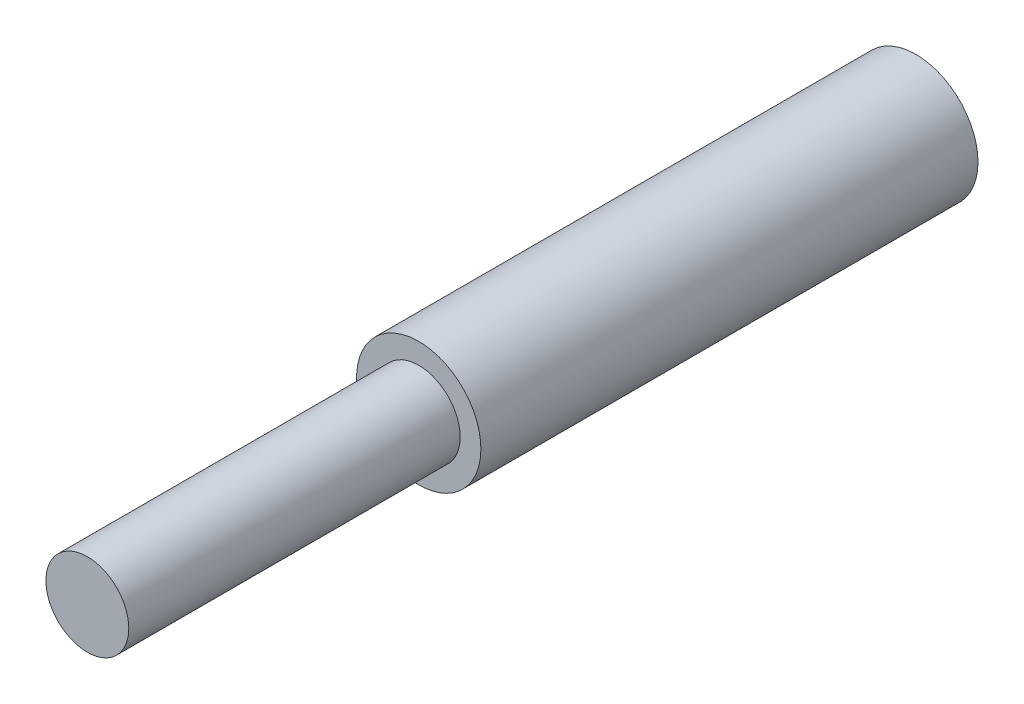
ISO-10303-21;
HEADER;
FILE_DESCRIPTION(('STEP AP214'),'2;1');
FILE_NAME('part.step','',(''),(''),'','','');
FILE_SCHEMA(('AUTOMOTIVE_DESIGN { 1 0 10303 214 1 1 1 1 }'));
ENDSEC;
DATA;
#1=APPLICATION_CONTEXT('core data for automotive mechanical design processes');
#2=APPLICATION_PROTOCOL_DEFINITION('international standard','automotive_design',2000,#1);
#3=PRODUCT_CONTEXT('',#1,'mechanical');
#4=PRODUCT('Part','Part','',(#3));
#5=PRODUCT_RELATED_PRODUCT_CATEGORY('part','',(#4));
#6=PRODUCT_DEFINITION_FORMATION('','',#4);
#7=PRODUCT_DEFINITION_CONTEXT('part definition',#1,'design');
#8=PRODUCT_DEFINITION('design','',#6,#7);
#9=PRODUCT_DEFINITION_SHAPE('','',#8);
#10=(LENGTH_UNIT() NAMED_UNIT(*) SI_UNIT(.MILLI.,.METRE.));
#11=(NAMED_UNIT(*) PLANE_ANGLE_UNIT() SI_UNIT($,.RADIAN.));
#12=(NAMED_UNIT(*) SI_UNIT($,.STERADIAN.) SOLID_ANGLE_UNIT());
#13=UNCERTAINTY_MEASURE_WITH_UNIT(LENGTH_MEASURE(1.E-05),#10,'distance_accuracy_value','');
#14=(GEOMETRIC_REPRESENTATION_CONTEXT(3) GLOBAL_UNCERTAINTY_ASSIGNED_CONTEXT((#13)) GLOBAL_UNIT_ASSIGNED_CONTEXT((#10,
#11,#12)) REPRESENTATION_CONTEXT('',''));
#15=CARTESIAN_POINT('',(0.,0.,0.));
#16=DIRECTION('',(0.,0.,1.));
#17=DIRECTION('',(1.,0.,0.));
#18=AXIS2_PLACEMENT_3D('',#15,#16,#17);
#19=CARTESIAN_POINT('',(0.,0.,100.));
#20=DIRECTION('',(0.,0.,-1.));
#21=DIRECTION('',(-1.,0.,0.));
#22=AXIS2_PLACEMENT_3D('',#19,#20,#21);
#23=CYLINDRICAL_SURFACE('',#22,7.5);
#24=CARTESIAN_POINT('',(0.,0.,0.));
#25=DIRECTION('',(0.,0.,1.));
#26=DIRECTION('',(1.,0.,0.));
#27=AXIS2_PLACEMENT_3D('',#24,#25,#26);
#28=CIRCLE('',#27,7.5);
#29=CARTESIAN_POINT('',(7.5,0.,0.));
#30=VERTEX_POINT('',#29);
#31=EDGE_CURVE('E139',#30,#30,#28,.T.);
#32=ORIENTED_EDGE('',*,*,#31,.T.);
#33=EDGE_LOOP('',(#32));
#34=FACE_BOUND('',#33,.T.);
#35=CARTESIAN_POINT('',(0.,0.,60.));
#36=DIRECTION('',(0.,0.,1.));
#37=DIRECTION('',(1.,0.,0.));
#38=AXIS2_PLACEMENT_3D('',#35,#36,#37);
#39=CIRCLE('',#38,7.5);
#40=CARTESIAN_POINT('',(7.5,0.,60.));
#41=VERTEX_POINT('',#40);
#42=EDGE_CURVE('E135',#41,#41,#39,.T.);
#43=ORIENTED_EDGE('',*,*,#42,.F.);
#44=EDGE_LOOP('',(#43));
#45=FACE_BOUND('',#44,.T.);
#46=ADVANCED_FACE('F48',(#34,#45),#23,.T.);
#47=CARTESIAN_POINT('',(0.,0.,0.));
#48=DIRECTION('',(0.,0.,1.));
#49=DIRECTION('',(1.,0.,0.));
#50=AXIS2_PLACEMENT_3D('',#47,#48,#49);
#51=PLANE('',#50);
#52=ORIENTED_EDGE('',*,*,#31,.F.);
#53=EDGE_LOOP('',(#52));
#54=FACE_BOUND('',#53,.T.);
#55=ADVANCED_FACE('F186',(#54),#51,.F.);
#56=CARTESIAN_POINT('',(0.,0.,60.));
#57=DIRECTION('',(0.,0.,1.));
#58=DIRECTION('',(1.,0.,0.));
#59=AXIS2_PLACEMENT_3D('',#56,#57,#58);
#60=PLANE('',#59);
#61=CARTESIAN_POINT('',(0.,0.,60.));
#62=DIRECTION('',(0.,0.,1.));
#63=DIRECTION('',(1.,0.,0.));
#64=AXIS2_PLACEMENT_3D('',#61,#62,#63);
#65=CIRCLE('',#64,5.);
#66=CARTESIAN_POINT('',(5.10341196725696E-11,-5.,60.));
#67=VERTEX_POINT('',#66);
#68=EDGE_CURVE('E131',#67,#67,#65,.T.);
#69=ORIENTED_EDGE('',*,*,#68,.F.);
#70=EDGE_LOOP('',(#69));
#71=FACE_BOUND('',#70,.T.);
#72=ORIENTED_EDGE('',*,*,#42,.T.);
#73=EDGE_LOOP('',(#72));
#74=FACE_BOUND('',#73,.T.);
#75=ADVANCED_FACE('F192',(#71,#74),#60,.T.);
#76=CARTESIAN_POINT('',(0.,0.,60.));
#77=DIRECTION('',(0.,0.,1.));
#78=DIRECTION('',(1.,0.,0.));
#79=AXIS2_PLACEMENT_3D('',#76,#77,#78);
#80=CYLINDRICAL_SURFACE('',#79,5.);
#81=CARTESIAN_POINT('',(1.50000000004889,-4.76969600706936,73.5));
#82=CARTESIAN_POINT('',(1.50000085361959,-4.76969249083397,73.541179392908));
#83=CARTESIAN_POINT('',(1.49830317088317,-4.77022996998593,73.5823380431261));
#84=CARTESIAN_POINT('',(1.49153785665208,-4.7723509510847,73.6643411620955));
#85=CARTESIAN_POINT('',(1.48647098280734,-4.77393421785852,73.7051856993949));
#86=CARTESIAN_POINT('',(1.4663020369421,-4.7801849061737,73.8265905409546));
#87=CARTESIAN_POINT('',(1.44623120418568,-4.78635370382792,73.9063063904163));
#88=CARTESIAN_POINT('',(1.39353102320548,-4.8019595211178,74.0610355783859));
#89=CARTESIAN_POINT('',(1.36090607073134,-4.81139539668998,74.1360505521981));
#90=CARTESIAN_POINT('',(1.28407841122608,-4.83246571210736,74.2795966815976));
#91=CARTESIAN_POINT('',(1.23987031656191,-4.84410117433662,74.3481247997284));
#92=CARTESIAN_POINT('',(1.13964850663316,-4.86866835243553,74.478866055997));
#93=CARTESIAN_POINT('',(1.08333433470212,-4.88162755411864,74.5408436603434));
#94=CARTESIAN_POINT('',(0.961138919923655,-4.90714811558064,74.6546355838999));
#95=CARTESIAN_POINT('',(0.89525606396678,-4.91970940784331,74.706448186003));
#96=CARTESIAN_POINT('',(0.754109921366105,-4.94333239726932,74.7994637703185));
#97=CARTESIAN_POINT('',(0.678680819387046,-4.95435770970658,74.8404251802979));
#98=CARTESIAN_POINT('',(0.521621185556751,-4.97334469845673,74.9089884116181));
#99=CARTESIAN_POINT('',(0.439992259063983,-4.98130716463452,74.9365936777943));
#100=CARTESIAN_POINT('',(0.275324697926051,-4.9930763993472,74.976879799102));
#101=CARTESIAN_POINT('',(0.192393125345466,-4.99699549276796,74.9899648579697));
#102=CARTESIAN_POINT('',(0.025423572049331,-5.000632020224,75.0021173413632));
#103=CARTESIAN_POINT('',(-0.058614196191116,-5.00035024971531,75.0011874197001));
#104=CARTESIAN_POINT('',(-0.22257159989482,-4.99569602566495,74.985607091241));
#105=CARTESIAN_POINT('',(-0.302537145413489,-4.99145415509497,74.9713946550213));
#106=CARTESIAN_POINT('',(-0.458890052050997,-4.9795151370045,74.9303683647619));
#107=CARTESIAN_POINT('',(-0.535277225481048,-4.97181780846577,74.903553850544));
#108=CARTESIAN_POINT('',(-0.683347815841449,-4.95365214926845,74.8377877783536));
#109=CARTESIAN_POINT('',(-0.754966005993479,-4.94315255693299,74.7986983556431));
#110=CARTESIAN_POINT('',(-0.890765529523988,-4.92049624652668,74.7096014099517));
#111=CARTESIAN_POINT('',(-0.954945191564289,-4.90833915736863,74.6595914405212));
#112=CARTESIAN_POINT('',(-1.0766545053627,-4.88311673572513,74.5478080119165));
#113=CARTESIAN_POINT('',(-1.13383351473042,-4.87003445450716,74.4856561362393));
#114=CARTESIAN_POINT('',(-1.23706769487521,-4.84484215115926,74.3525025765721));
#115=CARTESIAN_POINT('',(-1.28311962008124,-4.83273241338881,74.2814983196345));
#116=CARTESIAN_POINT('',(-1.36316407235932,-4.8107722879705,74.1317190715507));
#117=CARTESIAN_POINT('',(-1.39703006336214,-4.8009459624738,74.0528728204066));
#118=CARTESIAN_POINT('',(-1.45085885999795,-4.78495663654688,73.8902754960183));
#119=CARTESIAN_POINT('',(-1.47084293213138,-4.77878803477382,73.8065321392856));
#120=CARTESIAN_POINT('',(-1.48901203585188,-4.77314032326532,73.6850051109298));
#121=CARTESIAN_POINT('',(-1.49313202984118,-4.77185156276797,73.6481092658204));
#122=CARTESIAN_POINT('',(-1.49862355609965,-4.77012928613318,73.5741485209004));
#123=CARTESIAN_POINT('',(-1.4999991296338,-4.76969451248181,73.5370839503361));
#124=CARTESIAN_POINT('',(-1.49999999995112,-4.7696960071001,73.5));
#125=B_SPLINE_CURVE_WITH_KNOTS('',3,(#81,#82,#83,#84,#85,#86,#87,#88,#89,#90,#91,#92,#93,#94,
#95,#96,#97,#98,#99,#100,#101,#102,#103,#104,#105,#106,#107,#108,#109,#110,#111,#112,#113,#114,
#115,#116,#117,#118,#119,#120,#121,#122,#123,#124),.UNSPECIFIED.,.F.,.F.,(4,2,2,2,2,2,2,2,2,2,2,
2,2,2,2,2,2,2,2,2,2,4),(0.,0.123459071219737,0.246890388853026,0.492911349615204,
0.738846245884331,0.98489573682809,1.23795510798802,1.49105719006934,1.74939356197454,
2.00766326783256,2.25854751319802,2.5093842528947,2.75223130012966,2.99509107067836,
3.2407824256273,3.48652887757004,3.7417256831098,3.99699683536776,4.25484698071525,
4.51230123440206,4.62365084745809,4.73483637253619),.UNSPECIFIED.);
#126=CARTESIAN_POINT('',(1.50000000004889,-4.76969600706932,73.5));
#127=VERTEX_POINT('',#126);
#128=CARTESIAN_POINT('',(-1.49999999995112,-4.7696960071001,73.5));
#129=VERTEX_POINT('',#128);
#130=EDGE_CURVE('E143',#127,#129,#125,.T.);
#131=ORIENTED_EDGE('',*,*,#130,.F.);
#132=DIRECTION('',(0.,0.,1.));
#133=VECTOR('',#132,1.);
#134=CARTESIAN_POINT('',(1.50000000004899,-4.76969600706932,60.));
#135=LINE('',#134,#133);
#136=CARTESIAN_POINT('',(1.50000000004897,-4.76969600706933,61.5));
#137=VERTEX_POINT('',#136);
#138=EDGE_CURVE('E12',#137,#127,#135,.T.);
#139=ORIENTED_EDGE('',*,*,#138,.F.);
#140=CARTESIAN_POINT('',(-1.49999999995103,-4.76969600710013,61.5));
#141=CARTESIAN_POINT('',(-1.50000085352174,-4.76969249086474,61.4588206070919));
#142=CARTESIAN_POINT('',(-1.4983031707853,-4.77022997001667,61.4176619568738));
#143=CARTESIAN_POINT('',(-1.49153785655417,-4.7723509511153,61.3356588379044));
#144=CARTESIAN_POINT('',(-1.48647098270939,-4.77393421788902,61.2948143006051));
#145=CARTESIAN_POINT('',(-1.46630203684403,-4.78018490620379,61.1734094590453));
#146=CARTESIAN_POINT('',(-1.44623120408748,-4.7863537038576,61.0936936095836));
#147=CARTESIAN_POINT('',(-1.39353102310695,-4.80195952114639,60.9389644216141));
#148=CARTESIAN_POINT('',(-1.36090607063263,-4.8113953967179,60.8639494478019));
#149=CARTESIAN_POINT('',(-1.28407841112693,-4.8324657121337,60.7204033184024));
#150=CARTESIAN_POINT('',(-1.23987031646252,-4.84410117436206,60.6518752002715));
#151=CARTESIAN_POINT('',(-1.13964850653326,-4.86866835245891,60.5211339440029));
#152=CARTESIAN_POINT('',(-1.08333433460195,-4.88162755414087,60.4591563396565));
#153=CARTESIAN_POINT('',(-0.961138919822953,-4.90714811560037,60.3453644161));
#154=CARTESIAN_POINT('',(-0.895256063865817,-4.91970940786169,60.2935518139969));
#155=CARTESIAN_POINT('',(-0.754109921264656,-4.9433323972848,60.2005362296815));
#156=CARTESIAN_POINT('',(-0.678680819285372,-4.95435770972051,60.159574819702));
#157=CARTESIAN_POINT('',(-0.521621185454693,-4.97334469846744,60.0910115883818));
#158=CARTESIAN_POINT('',(-0.439992258961766,-4.98130716464355,60.0634063222057));
#159=CARTESIAN_POINT('',(-0.275324697823598,-4.99307639935285,60.0231202008979));
#160=CARTESIAN_POINT('',(-0.192393125242934,-4.9969954927719,60.0100351420302));
#161=CARTESIAN_POINT('',(-0.0254235719467276,-5.00063202022452,59.9978826586367));
#162=CARTESIAN_POINT('',(0.0586141962937121,-5.00035024971411,59.9988125802998));
#163=CARTESIAN_POINT('',(0.222571599997317,-4.99569602566038,60.014392908759));
#164=CARTESIAN_POINT('',(0.302537145515897,-4.99145415508877,60.0286053449787));
#165=CARTESIAN_POINT('',(0.458890052153158,-4.97951513699509,60.0696316352381));
#166=CARTESIAN_POINT('',(0.53527722558305,-4.97181780845479,60.0964461494559));
#167=CARTESIAN_POINT('',(0.683347815943082,-4.95365214925443,60.1622122216464));
#168=CARTESIAN_POINT('',(0.754966006094901,-4.9431525569175,60.2013016443569));
#169=CARTESIAN_POINT('',(0.890765529624948,-4.92049624650841,60.2903985900483));
#170=CARTESIAN_POINT('',(0.954945191664998,-4.90833915734904,60.3404085594788));
#171=CARTESIAN_POINT('',(1.07665450546289,-4.88311673570304,60.4521919880835));
#172=CARTESIAN_POINT('',(1.13383351483035,-4.87003445448389,60.5143438637607));
#173=CARTESIAN_POINT('',(1.23706769497462,-4.84484215113388,60.6474974234279));
#174=CARTESIAN_POINT('',(1.28311962018041,-4.83273241336248,60.7185016803655));
#175=CARTESIAN_POINT('',(1.36316407245804,-4.81077228794253,60.8682809284493));
#176=CARTESIAN_POINT('',(1.39703006346065,-4.80094596244513,60.9471271795934));
#177=CARTESIAN_POINT('',(1.45085886009613,-4.78495663651711,61.1097245039817));
#178=CARTESIAN_POINT('',(1.47084293222943,-4.77878803474364,61.1934678607144));
#179=CARTESIAN_POINT('',(1.48901203594981,-4.77314032323477,61.3149948890702));
#180=CARTESIAN_POINT('',(1.49313202993908,-4.77185156273734,61.3518907341796));
#181=CARTESIAN_POINT('',(1.49862355619752,-4.77012928610243,61.4258514790995));
#182=CARTESIAN_POINT('',(1.49999912973166,-4.76969451245104,61.4629160496638));
#183=CARTESIAN_POINT('',(1.50000000004897,-4.76969600706933,61.5));
#184=B_SPLINE_CURVE_WITH_KNOTS('',3,(#140,#141,#142,#143,#144,#145,#146,#147,#148,#149,#150,
#151,#152,#153,#154,#155,#156,#157,#158,#159,#160,#161,#162,#163,#164,#165,#166,#167,#168,#169,
#170,#171,#172,#173,#174,#175,#176,#177,#178,#179,#180,#181,#182,#183),.UNSPECIFIED.,.F.,.F.,(4,
2,2,2,2,2,2,2,2,2,2,2,2,2,2,2,2,2,2,2,2,4),(0.,0.123459071219744,0.246890388853047,
0.492911349615219,0.738846245884331,0.984895736828099,1.23795510798805,1.49105719006938,
1.74939356197457,2.00766326783257,2.25854751319802,2.5093842528947,2.75223130012966,
2.99509107067836,3.24078242562731,3.48652887757005,3.74172568310982,3.99699683536779,
4.25484698071529,4.51230123440208,4.62365084745809,4.73483637253615),.UNSPECIFIED.);
#185=EDGE_CURVE('E97',#67,#137,#184,.T.);
#186=ORIENTED_EDGE('',*,*,#185,.F.);
#187=ORIENTED_EDGE('',*,*,#68,.T.);
#188=CARTESIAN_POINT('',(-1.49999999995103,-4.76969600710014,61.5));
#189=VERTEX_POINT('',#188);
#190=EDGE_CURVE('E56',#189,#67,#184,.T.);
#191=ORIENTED_EDGE('',*,*,#190,.F.);
#192=DIRECTION('',(0.,0.,1.));
#193=VECTOR('',#192,1.);
#194=CARTESIAN_POINT('',(-1.49999999995102,-4.76969600710014,60.));
#195=LINE('',#194,#193);
#196=EDGE_CURVE('E70',#129,#189,#195,.F.);
#197=ORIENTED_EDGE('',*,*,#196,.F.);
#198=EDGE_LOOP('',(#131,#139,#186,#187,#191,#197));
#199=FACE_BOUND('',#198,.T.);
#200=CARTESIAN_POINT('',(0.,0.,100.));
#201=DIRECTION('',(0.,0.,1.));
#202=DIRECTION('',(1.,0.,0.));
#203=AXIS2_PLACEMENT_3D('',#200,#201,#202);
#204=CIRCLE('',#203,5.);
#205=CARTESIAN_POINT('',(5.,0.,100.));
#206=VERTEX_POINT('',#205);
#207=EDGE_CURVE('E125',#206,#206,#204,.T.);
#208=ORIENTED_EDGE('',*,*,#207,.F.);
#209=EDGE_LOOP('',(#208));
#210=FACE_BOUND('',#209,.T.);
#211=ADVANCED_FACE('F155',(#199,#210),#80,.T.);
#212=CARTESIAN_POINT('',(0.,0.,100.));
#213=DIRECTION('',(0.,0.,1.));
#214=DIRECTION('',(1.,0.,0.));
#215=AXIS2_PLACEMENT_3D('',#212,#213,#214);
#216=PLANE('',#215);
#217=ORIENTED_EDGE('',*,*,#207,.T.);
#218=EDGE_LOOP('',(#217));
#219=FACE_BOUND('',#218,.T.);
#220=ADVANCED_FACE('F170',(#219),#216,.T.);
#221=CARTESIAN_POINT('',(3.29498006874567E-11,-3.2,61.5));
#222=DIRECTION('',(1.02068239345139E-11,-1.,0.));
#223=DIRECTION('',(1.,1.02068239345139E-11,0.));
#224=AXIS2_PLACEMENT_3D('',#221,#222,#223);
#225=CYLINDRICAL_SURFACE('',#224,1.5);
#226=ORIENTED_EDGE('',*,*,#190,.T.);
#227=ORIENTED_EDGE('',*,*,#185,.T.);
#228=DIRECTION('',(1.02068239345139E-11,-1.,0.));
#229=VECTOR('',#228,1.);
#230=CARTESIAN_POINT('',(1.50000000003295,-3.19999999998469,61.5));
#231=LINE('',#230,#229);
#232=CARTESIAN_POINT('',(1.50000000003295,-3.19999999998469,61.5));
#233=VERTEX_POINT('',#232);
#234=EDGE_CURVE('E62',#233,#137,#231,.T.);
#235=ORIENTED_EDGE('',*,*,#234,.F.);
#236=CARTESIAN_POINT('',(3.29498006874567E-11,-3.2,61.5));
#237=DIRECTION('',(1.02068239345139E-11,-1.,0.));
#238=DIRECTION('',(1.,1.02068239345139E-11,0.));
#239=AXIS2_PLACEMENT_3D('',#236,#237,#238);
#240=CIRCLE('',#239,1.5);
#241=CARTESIAN_POINT('',(-1.49999999996705,-3.20000000001531,61.5));
#242=VERTEX_POINT('',#241);
#243=EDGE_CURVE('E94',#242,#233,#240,.T.);
#244=ORIENTED_EDGE('',*,*,#243,.F.);
#245=DIRECTION('',(1.02068239345139E-11,-1.,0.));
#246=VECTOR('',#245,1.);
#247=CARTESIAN_POINT('',(-1.49999999996705,-3.20000000001531,61.5));
#248=LINE('',#247,#246);
#249=EDGE_CURVE('E122',#242,#189,#248,.T.);
#250=ORIENTED_EDGE('',*,*,#249,.T.);
#251=EDGE_LOOP('',(#226,#227,#235,#244,#250));
#252=FACE_BOUND('',#251,.T.);
#253=ADVANCED_FACE('F92',(#252),#225,.F.);
#254=CARTESIAN_POINT('',(-1.49999999996705,-3.20000000001531,61.5));
#255=DIRECTION('',(-1.,-1.02068239345139E-11,0.));
#256=DIRECTION('',(1.02068239345139E-11,-1.,0.));
#257=AXIS2_PLACEMENT_3D('',#254,#255,#256);
#258=PLANE('',#257);
#259=ORIENTED_EDGE('',*,*,#196,.T.);
#260=ORIENTED_EDGE('',*,*,#249,.F.);
#261=DIRECTION('',(0.,0.,-1.));
#262=VECTOR('',#261,1.);
#263=CARTESIAN_POINT('',(-1.49999999996705,-3.20000000001531,61.5));
#264=LINE('',#263,#262);
#265=CARTESIAN_POINT('',(-1.49999999996714,-3.20000000001531,73.5));
#266=VERTEX_POINT('',#265);
#267=EDGE_CURVE('E101',#266,#242,#264,.T.);
#268=ORIENTED_EDGE('',*,*,#267,.F.);
#269=DIRECTION('',(1.02068239345139E-11,-1.,0.));
#270=VECTOR('',#269,1.);
#271=CARTESIAN_POINT('',(-1.49999999996714,-3.20000000001531,73.5));
#272=LINE('',#271,#270);
#273=EDGE_CURVE('E126',#266,#129,#272,.T.);
#274=ORIENTED_EDGE('',*,*,#273,.T.);
#275=EDGE_LOOP('',(#259,#260,#268,#274));
#276=FACE_BOUND('',#275,.T.);
#277=ADVANCED_FACE('F164',(#276),#258,.F.);
#278=CARTESIAN_POINT('',(3.28630645136579E-11,-3.2,73.5));
#279=DIRECTION('',(1.02068239345139E-11,-1.,0.));
#280=DIRECTION('',(1.,1.02068239345139E-11,0.));
#281=AXIS2_PLACEMENT_3D('',#278,#279,#280);
#282=CYLINDRICAL_SURFACE('',#281,1.5);
#283=DIRECTION('',(1.02068239345139E-11,-1.,0.));
#284=VECTOR('',#283,1.);
#285=CARTESIAN_POINT('',(1.50000000003286,-3.19999999998469,73.5));
#286=LINE('',#285,#284);
#287=CARTESIAN_POINT('',(1.50000000003286,-3.19999999998469,73.5));
#288=VERTEX_POINT('',#287);
#289=EDGE_CURVE('E100',#288,#127,#286,.T.);
#290=ORIENTED_EDGE('',*,*,#289,.T.);
#291=ORIENTED_EDGE('',*,*,#130,.T.);
#292=ORIENTED_EDGE('',*,*,#273,.F.);
#293=CARTESIAN_POINT('',(3.28630645136579E-11,-3.2,73.5));
#294=DIRECTION('',(1.02068239345139E-11,-1.,0.));
#295=DIRECTION('',(1.,1.02068239345139E-11,0.));
#296=AXIS2_PLACEMENT_3D('',#293,#294,#295);
#297=CIRCLE('',#296,1.5);
#298=EDGE_CURVE('E111',#288,#266,#297,.T.);
#299=ORIENTED_EDGE('',*,*,#298,.F.);
#300=EDGE_LOOP('',(#290,#291,#292,#299));
#301=FACE_BOUND('',#300,.T.);
#302=ADVANCED_FACE('F159',(#301),#282,.F.);
#303=CARTESIAN_POINT('',(1.50000000003295,-3.19999999998469,61.5));
#304=DIRECTION('',(1.,1.02068239345139E-11,0.));
#305=DIRECTION('',(-1.02068239345139E-11,1.,0.));
#306=AXIS2_PLACEMENT_3D('',#303,#304,#305);
#307=PLANE('',#306);
#308=ORIENTED_EDGE('',*,*,#138,.T.);
#309=ORIENTED_EDGE('',*,*,#289,.F.);
#310=DIRECTION('',(0.,0.,1.));
#311=VECTOR('',#310,1.);
#312=CARTESIAN_POINT('',(1.50000000003295,-3.19999999998469,61.5));
#313=LINE('',#312,#311);
#314=EDGE_CURVE('E104',#233,#288,#313,.T.);
#315=ORIENTED_EDGE('',*,*,#314,.F.);
#316=ORIENTED_EDGE('',*,*,#234,.T.);
#317=EDGE_LOOP('',(#308,#309,#315,#316));
#318=FACE_BOUND('',#317,.T.);
#319=ADVANCED_FACE('F105',(#318),#307,.F.);
#320=CARTESIAN_POINT('',(3.29498006874567E-11,-3.2,61.5));
#321=DIRECTION('',(1.02068239345139E-11,-1.,0.));
#322=DIRECTION('',(1.,1.02068239345139E-11,0.));
#323=AXIS2_PLACEMENT_3D('',#320,#321,#322);
#324=PLANE('',#323);
#325=ORIENTED_EDGE('',*,*,#243,.T.);
#326=ORIENTED_EDGE('',*,*,#314,.T.);
#327=ORIENTED_EDGE('',*,*,#298,.T.);
#328=ORIENTED_EDGE('',*,*,#267,.T.);
#329=EDGE_LOOP('',(#325,#326,#327,#328));
#330=FACE_BOUND('',#329,.T.);
#331=ADVANCED_FACE('F113',(#330),#324,.T.);
#332=CLOSED_SHELL('',(#46,#55,#75,#211,#220,#253,#277,#302,#319,#331));
#333=MANIFOLD_SOLID_BREP('B2',#332);
#334=ADVANCED_BREP_SHAPE_REPRESENTATION('',(#18,#333),#14);
#335=SHAPE_DEFINITION_REPRESENTATION(#9,#334);
ENDSEC;
END-ISO-10303-21;
